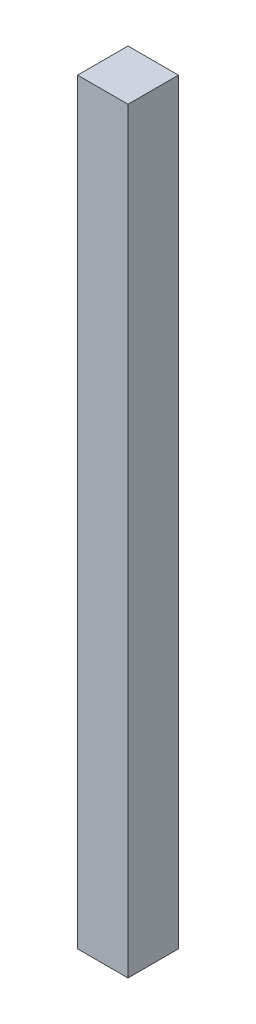
ISO-10303-21;
HEADER;
FILE_DESCRIPTION(('STEP AP214'),'2;1');
FILE_NAME('part.step','',(''),(''),'','','');
FILE_SCHEMA(('AUTOMOTIVE_DESIGN { 1 0 10303 214 1 1 1 1 }'));
ENDSEC;
DATA;
#1=APPLICATION_CONTEXT('core data for automotive mechanical design processes');
#2=APPLICATION_PROTOCOL_DEFINITION('international standard','automotive_design',2000,#1);
#3=PRODUCT_CONTEXT('',#1,'mechanical');
#4=PRODUCT('Part','Part','',(#3));
#5=PRODUCT_RELATED_PRODUCT_CATEGORY('part','',(#4));
#6=PRODUCT_DEFINITION_FORMATION('','',#4);
#7=PRODUCT_DEFINITION_CONTEXT('part definition',#1,'design');
#8=PRODUCT_DEFINITION('design','',#6,#7);
#9=PRODUCT_DEFINITION_SHAPE('','',#8);
#10=(LENGTH_UNIT() NAMED_UNIT(*) SI_UNIT(.MILLI.,.METRE.));
#11=(NAMED_UNIT(*) PLANE_ANGLE_UNIT() SI_UNIT($,.RADIAN.));
#12=(NAMED_UNIT(*) SI_UNIT($,.STERADIAN.) SOLID_ANGLE_UNIT());
#13=UNCERTAINTY_MEASURE_WITH_UNIT(LENGTH_MEASURE(1.E-05),#10,'distance_accuracy_value','');
#14=(GEOMETRIC_REPRESENTATION_CONTEXT(3) GLOBAL_UNCERTAINTY_ASSIGNED_CONTEXT((#13)) GLOBAL_UNIT_ASSIGNED_CONTEXT((#10,
#11,#12)) REPRESENTATION_CONTEXT('',''));
#15=CARTESIAN_POINT('',(0.,0.,0.));
#16=DIRECTION('',(0.,0.,1.));
#17=DIRECTION('',(1.,0.,0.));
#18=AXIS2_PLACEMENT_3D('',#15,#16,#17);
#19=CARTESIAN_POINT('',(10.,300.,10.));
#20=DIRECTION('',(-1.,0.,0.));
#21=DIRECTION('',(0.,0.,1.));
#22=AXIS2_PLACEMENT_3D('',#19,#20,#21);
#23=PLANE('',#22);
#24=DIRECTION('',(0.,0.,-1.));
#25=VECTOR('',#24,1.);
#26=CARTESIAN_POINT('',(10.,0.,10.));
#27=LINE('',#26,#25);
#28=CARTESIAN_POINT('',(10.,0.,10.));
#29=VERTEX_POINT('',#28);
#30=CARTESIAN_POINT('',(10.,0.,-10.));
#31=VERTEX_POINT('',#30);
#32=EDGE_CURVE('E100',#29,#31,#27,.T.);
#33=ORIENTED_EDGE('',*,*,#32,.T.);
#34=DIRECTION('',(0.,-1.,0.));
#35=VECTOR('',#34,1.);
#36=CARTESIAN_POINT('',(10.,300.,-10.));
#37=LINE('',#36,#35);
#38=CARTESIAN_POINT('',(10.,300.,-10.));
#39=VERTEX_POINT('',#38);
#40=EDGE_CURVE('E11',#39,#31,#37,.T.);
#41=ORIENTED_EDGE('',*,*,#40,.F.);
#42=DIRECTION('',(0.,0.,-1.));
#43=VECTOR('',#42,1.);
#44=CARTESIAN_POINT('',(10.,300.,10.));
#45=LINE('',#44,#43);
#46=CARTESIAN_POINT('',(10.,300.,10.));
#47=VERTEX_POINT('',#46);
#48=EDGE_CURVE('E88',#47,#39,#45,.T.);
#49=ORIENTED_EDGE('',*,*,#48,.F.);
#50=DIRECTION('',(0.,-1.,0.));
#51=VECTOR('',#50,1.);
#52=CARTESIAN_POINT('',(10.,300.,10.));
#53=LINE('',#52,#51);
#54=EDGE_CURVE('E96',#47,#29,#53,.T.);
#55=ORIENTED_EDGE('',*,*,#54,.T.);
#56=EDGE_LOOP('',(#33,#41,#49,#55));
#57=FACE_BOUND('',#56,.T.);
#58=ADVANCED_FACE('F37',(#57),#23,.F.);
#59=CARTESIAN_POINT('',(-10.,300.,-10.));
#60=DIRECTION('',(0.,0.,1.));
#61=DIRECTION('',(1.,0.,0.));
#62=AXIS2_PLACEMENT_3D('',#59,#60,#61);
#63=PLANE('',#62);
#64=DIRECTION('',(-1.,0.,0.));
#65=VECTOR('',#64,1.);
#66=CARTESIAN_POINT('',(-10.,0.,-10.));
#67=LINE('',#66,#65);
#68=CARTESIAN_POINT('',(-10.,0.,-10.));
#69=VERTEX_POINT('',#68);
#70=EDGE_CURVE('E92',#31,#69,#67,.T.);
#71=ORIENTED_EDGE('',*,*,#70,.T.);
#72=DIRECTION('',(0.,-1.,0.));
#73=VECTOR('',#72,1.);
#74=CARTESIAN_POINT('',(-10.,300.,-10.));
#75=LINE('',#74,#73);
#76=CARTESIAN_POINT('',(-10.,300.,-10.));
#77=VERTEX_POINT('',#76);
#78=EDGE_CURVE('E45',#77,#69,#75,.T.);
#79=ORIENTED_EDGE('',*,*,#78,.F.);
#80=DIRECTION('',(-1.,0.,0.));
#81=VECTOR('',#80,1.);
#82=CARTESIAN_POINT('',(-10.,300.,-10.));
#83=LINE('',#82,#81);
#84=EDGE_CURVE('E83',#39,#77,#83,.T.);
#85=ORIENTED_EDGE('',*,*,#84,.F.);
#86=ORIENTED_EDGE('',*,*,#40,.T.);
#87=EDGE_LOOP('',(#71,#79,#85,#86));
#88=FACE_BOUND('',#87,.T.);
#89=ADVANCED_FACE('F91',(#88),#63,.F.);
#90=CARTESIAN_POINT('',(-10.,300.,10.));
#91=DIRECTION('',(1.,0.,0.));
#92=DIRECTION('',(0.,0.,-1.));
#93=AXIS2_PLACEMENT_3D('',#90,#91,#92);
#94=PLANE('',#93);
#95=DIRECTION('',(0.,0.,1.));
#96=VECTOR('',#95,1.);
#97=CARTESIAN_POINT('',(-10.,0.,10.));
#98=LINE('',#97,#96);
#99=CARTESIAN_POINT('',(-10.,0.,10.));
#100=VERTEX_POINT('',#99);
#101=EDGE_CURVE('E70',#69,#100,#98,.T.);
#102=ORIENTED_EDGE('',*,*,#101,.T.);
#103=DIRECTION('',(0.,-1.,0.));
#104=VECTOR('',#103,1.);
#105=CARTESIAN_POINT('',(-10.,300.,10.));
#106=LINE('',#105,#104);
#107=CARTESIAN_POINT('',(-10.,300.,10.));
#108=VERTEX_POINT('',#107);
#109=EDGE_CURVE('E93',#108,#100,#106,.T.);
#110=ORIENTED_EDGE('',*,*,#109,.F.);
#111=DIRECTION('',(0.,0.,1.));
#112=VECTOR('',#111,1.);
#113=CARTESIAN_POINT('',(-10.,300.,10.));
#114=LINE('',#113,#112);
#115=EDGE_CURVE('E86',#77,#108,#114,.T.);
#116=ORIENTED_EDGE('',*,*,#115,.F.);
#117=ORIENTED_EDGE('',*,*,#78,.T.);
#118=EDGE_LOOP('',(#102,#110,#116,#117));
#119=FACE_BOUND('',#118,.T.);
#120=ADVANCED_FACE('F94',(#119),#94,.F.);
#121=CARTESIAN_POINT('',(-10.,300.,10.));
#122=DIRECTION('',(0.,0.,-1.));
#123=DIRECTION('',(-1.,0.,0.));
#124=AXIS2_PLACEMENT_3D('',#121,#122,#123);
#125=PLANE('',#124);
#126=DIRECTION('',(1.,0.,0.));
#127=VECTOR('',#126,1.);
#128=CARTESIAN_POINT('',(-10.,0.,10.));
#129=LINE('',#128,#127);
#130=EDGE_CURVE('E76',#100,#29,#129,.T.);
#131=ORIENTED_EDGE('',*,*,#130,.T.);
#132=ORIENTED_EDGE('',*,*,#54,.F.);
#133=DIRECTION('',(1.,0.,0.));
#134=VECTOR('',#133,1.);
#135=CARTESIAN_POINT('',(-10.,300.,10.));
#136=LINE('',#135,#134);
#137=EDGE_CURVE('E53',#108,#47,#136,.T.);
#138=ORIENTED_EDGE('',*,*,#137,.F.);
#139=ORIENTED_EDGE('',*,*,#109,.T.);
#140=EDGE_LOOP('',(#131,#132,#138,#139));
#141=FACE_BOUND('',#140,.T.);
#142=ADVANCED_FACE('F107',(#141),#125,.F.);
#143=CARTESIAN_POINT('',(0.,300.,0.));
#144=DIRECTION('',(0.,-1.,0.));
#145=DIRECTION('',(0.,0.,-1.));
#146=AXIS2_PLACEMENT_3D('',#143,#144,#145);
#147=PLANE('',#146);
#148=ORIENTED_EDGE('',*,*,#48,.T.);
#149=ORIENTED_EDGE('',*,*,#84,.T.);
#150=ORIENTED_EDGE('',*,*,#115,.T.);
#151=ORIENTED_EDGE('',*,*,#137,.T.);
#152=EDGE_LOOP('',(#148,#149,#150,#151));
#153=FACE_BOUND('',#152,.T.);
#154=ADVANCED_FACE('F84',(#153),#147,.F.);
#155=CARTESIAN_POINT('',(0.,0.,0.));
#156=DIRECTION('',(0.,-1.,0.));
#157=DIRECTION('',(0.,0.,-1.));
#158=AXIS2_PLACEMENT_3D('',#155,#156,#157);
#159=PLANE('',#158);
#160=ORIENTED_EDGE('',*,*,#32,.F.);
#161=ORIENTED_EDGE('',*,*,#130,.F.);
#162=ORIENTED_EDGE('',*,*,#101,.F.);
#163=ORIENTED_EDGE('',*,*,#70,.F.);
#164=EDGE_LOOP('',(#160,#161,#162,#163));
#165=FACE_BOUND('',#164,.T.);
#166=ADVANCED_FACE('F110',(#165),#159,.T.);
#167=CLOSED_SHELL('',(#58,#89,#120,#142,#154,#166));
#168=MANIFOLD_SOLID_BREP('B2',#167);
#169=ADVANCED_BREP_SHAPE_REPRESENTATION('',(#18,#168),#14);
#170=SHAPE_DEFINITION_REPRESENTATION(#9,#169);
ENDSEC;
END-ISO-10303-21;
